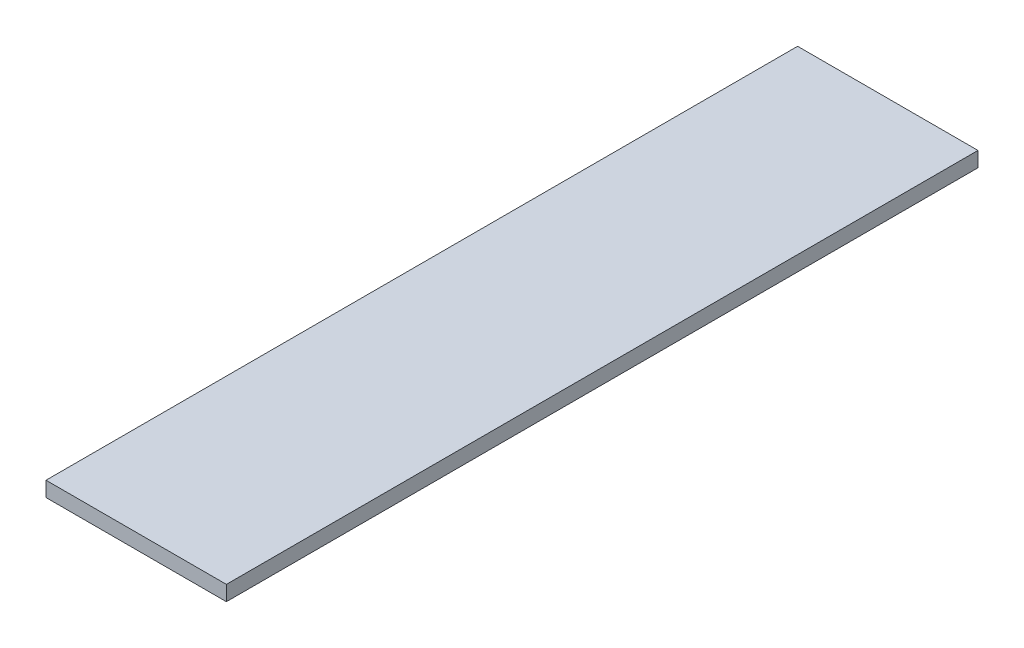
ISO-10303-21;
HEADER;
FILE_DESCRIPTION(('STEP AP214'),'2;1');
FILE_NAME('part.step','',(''),(''),'','','');
FILE_SCHEMA(('AUTOMOTIVE_DESIGN { 1 0 10303 214 1 1 1 1 }'));
ENDSEC;
DATA;
#1=APPLICATION_CONTEXT('core data for automotive mechanical design processes');
#2=APPLICATION_PROTOCOL_DEFINITION('international standard','automotive_design',2000,#1);
#3=PRODUCT_CONTEXT('',#1,'mechanical');
#4=PRODUCT('Part','Part','',(#3));
#5=PRODUCT_RELATED_PRODUCT_CATEGORY('part','',(#4));
#6=PRODUCT_DEFINITION_FORMATION('','',#4);
#7=PRODUCT_DEFINITION_CONTEXT('part definition',#1,'design');
#8=PRODUCT_DEFINITION('design','',#6,#7);
#9=PRODUCT_DEFINITION_SHAPE('','',#8);
#10=(LENGTH_UNIT() NAMED_UNIT(*) SI_UNIT(.MILLI.,.METRE.));
#11=(NAMED_UNIT(*) PLANE_ANGLE_UNIT() SI_UNIT($,.RADIAN.));
#12=(NAMED_UNIT(*) SI_UNIT($,.STERADIAN.) SOLID_ANGLE_UNIT());
#13=UNCERTAINTY_MEASURE_WITH_UNIT(LENGTH_MEASURE(1.E-05),#10,'distance_accuracy_value','');
#14=(GEOMETRIC_REPRESENTATION_CONTEXT(3) GLOBAL_UNCERTAINTY_ASSIGNED_CONTEXT((#13)) GLOBAL_UNIT_ASSIGNED_CONTEXT((#10,
#11,#12)) REPRESENTATION_CONTEXT('',''));
#15=CARTESIAN_POINT('',(0.,0.,0.));
#16=DIRECTION('',(0.,0.,1.));
#17=DIRECTION('',(1.,0.,0.));
#18=AXIS2_PLACEMENT_3D('',#15,#16,#17);
#19=CARTESIAN_POINT('',(0.,0.,500.));
#20=DIRECTION('',(1.,0.,0.));
#21=DIRECTION('',(0.,1.,0.));
#22=AXIS2_PLACEMENT_3D('',#19,#20,#21);
#23=PLANE('',#22);
#24=DIRECTION('',(0.,-1.,0.));
#25=VECTOR('',#24,1.);
#26=CARTESIAN_POINT('',(0.,0.,0.));
#27=LINE('',#26,#25);
#28=CARTESIAN_POINT('',(0.,0.,0.));
#29=VERTEX_POINT('',#28);
#30=CARTESIAN_POINT('',(0.,-10.,0.));
#31=VERTEX_POINT('',#30);
#32=EDGE_CURVE('E102',#29,#31,#27,.T.);
#33=ORIENTED_EDGE('',*,*,#32,.T.);
#34=DIRECTION('',(0.,0.,-1.));
#35=VECTOR('',#34,1.);
#36=CARTESIAN_POINT('',(0.,-10.,500.));
#37=LINE('',#36,#35);
#38=CARTESIAN_POINT('',(0.,-10.,500.));
#39=VERTEX_POINT('',#38);
#40=EDGE_CURVE('E11',#39,#31,#37,.T.);
#41=ORIENTED_EDGE('',*,*,#40,.F.);
#42=DIRECTION('',(0.,-1.,0.));
#43=VECTOR('',#42,1.);
#44=CARTESIAN_POINT('',(0.,0.,500.));
#45=LINE('',#44,#43);
#46=CARTESIAN_POINT('',(0.,0.,500.));
#47=VERTEX_POINT('',#46);
#48=EDGE_CURVE('E90',#47,#39,#45,.T.);
#49=ORIENTED_EDGE('',*,*,#48,.F.);
#50=DIRECTION('',(0.,0.,-1.));
#51=VECTOR('',#50,1.);
#52=CARTESIAN_POINT('',(0.,0.,500.));
#53=LINE('',#52,#51);
#54=EDGE_CURVE('E98',#47,#29,#53,.T.);
#55=ORIENTED_EDGE('',*,*,#54,.T.);
#56=EDGE_LOOP('',(#33,#41,#49,#55));
#57=FACE_BOUND('',#56,.T.);
#58=ADVANCED_FACE('F39',(#57),#23,.F.);
#59=CARTESIAN_POINT('',(0.,-10.,500.));
#60=DIRECTION('',(0.,1.,0.));
#61=DIRECTION('',(0.,0.,1.));
#62=AXIS2_PLACEMENT_3D('',#59,#60,#61);
#63=PLANE('',#62);
#64=DIRECTION('',(1.,0.,0.));
#65=VECTOR('',#64,1.);
#66=CARTESIAN_POINT('',(0.,-10.,0.));
#67=LINE('',#66,#65);
#68=CARTESIAN_POINT('',(120.,-10.,0.));
#69=VERTEX_POINT('',#68);
#70=EDGE_CURVE('E94',#31,#69,#67,.T.);
#71=ORIENTED_EDGE('',*,*,#70,.T.);
#72=DIRECTION('',(0.,0.,-1.));
#73=VECTOR('',#72,1.);
#74=CARTESIAN_POINT('',(120.,-10.,500.));
#75=LINE('',#74,#73);
#76=CARTESIAN_POINT('',(120.,-10.,500.));
#77=VERTEX_POINT('',#76);
#78=EDGE_CURVE('E47',#77,#69,#75,.T.);
#79=ORIENTED_EDGE('',*,*,#78,.F.);
#80=DIRECTION('',(1.,0.,0.));
#81=VECTOR('',#80,1.);
#82=CARTESIAN_POINT('',(0.,-10.,500.));
#83=LINE('',#82,#81);
#84=EDGE_CURVE('E85',#39,#77,#83,.T.);
#85=ORIENTED_EDGE('',*,*,#84,.F.);
#86=ORIENTED_EDGE('',*,*,#40,.T.);
#87=EDGE_LOOP('',(#71,#79,#85,#86));
#88=FACE_BOUND('',#87,.T.);
#89=ADVANCED_FACE('F93',(#88),#63,.F.);
#90=CARTESIAN_POINT('',(120.,0.,500.));
#91=DIRECTION('',(-1.,0.,0.));
#92=DIRECTION('',(0.,0.,1.));
#93=AXIS2_PLACEMENT_3D('',#90,#91,#92);
#94=PLANE('',#93);
#95=DIRECTION('',(0.,1.,0.));
#96=VECTOR('',#95,1.);
#97=CARTESIAN_POINT('',(120.,0.,0.));
#98=LINE('',#97,#96);
#99=CARTESIAN_POINT('',(120.,0.,0.));
#100=VERTEX_POINT('',#99);
#101=EDGE_CURVE('E72',#69,#100,#98,.T.);
#102=ORIENTED_EDGE('',*,*,#101,.T.);
#103=DIRECTION('',(0.,0.,-1.));
#104=VECTOR('',#103,1.);
#105=CARTESIAN_POINT('',(120.,0.,500.));
#106=LINE('',#105,#104);
#107=CARTESIAN_POINT('',(120.,0.,500.));
#108=VERTEX_POINT('',#107);
#109=EDGE_CURVE('E95',#108,#100,#106,.T.);
#110=ORIENTED_EDGE('',*,*,#109,.F.);
#111=DIRECTION('',(0.,1.,0.));
#112=VECTOR('',#111,1.);
#113=CARTESIAN_POINT('',(120.,0.,500.));
#114=LINE('',#113,#112);
#115=EDGE_CURVE('E88',#77,#108,#114,.T.);
#116=ORIENTED_EDGE('',*,*,#115,.F.);
#117=ORIENTED_EDGE('',*,*,#78,.T.);
#118=EDGE_LOOP('',(#102,#110,#116,#117));
#119=FACE_BOUND('',#118,.T.);
#120=ADVANCED_FACE('F96',(#119),#94,.F.);
#121=CARTESIAN_POINT('',(0.,0.,500.));
#122=DIRECTION('',(0.,-1.,0.));
#123=DIRECTION('',(0.,0.,-1.));
#124=AXIS2_PLACEMENT_3D('',#121,#122,#123);
#125=PLANE('',#124);
#126=DIRECTION('',(-1.,0.,0.));
#127=VECTOR('',#126,1.);
#128=CARTESIAN_POINT('',(0.,0.,0.));
#129=LINE('',#128,#127);
#130=EDGE_CURVE('E78',#100,#29,#129,.T.);
#131=ORIENTED_EDGE('',*,*,#130,.T.);
#132=ORIENTED_EDGE('',*,*,#54,.F.);
#133=DIRECTION('',(-1.,0.,0.));
#134=VECTOR('',#133,1.);
#135=CARTESIAN_POINT('',(0.,0.,500.));
#136=LINE('',#135,#134);
#137=EDGE_CURVE('E55',#108,#47,#136,.T.);
#138=ORIENTED_EDGE('',*,*,#137,.F.);
#139=ORIENTED_EDGE('',*,*,#109,.T.);
#140=EDGE_LOOP('',(#131,#132,#138,#139));
#141=FACE_BOUND('',#140,.T.);
#142=ADVANCED_FACE('F109',(#141),#125,.F.);
#143=CARTESIAN_POINT('',(0.,0.,500.));
#144=DIRECTION('',(0.,0.,1.));
#145=DIRECTION('',(1.,0.,0.));
#146=AXIS2_PLACEMENT_3D('',#143,#144,#145);
#147=PLANE('',#146);
#148=ORIENTED_EDGE('',*,*,#48,.T.);
#149=ORIENTED_EDGE('',*,*,#84,.T.);
#150=ORIENTED_EDGE('',*,*,#115,.T.);
#151=ORIENTED_EDGE('',*,*,#137,.T.);
#152=EDGE_LOOP('',(#148,#149,#150,#151));
#153=FACE_BOUND('',#152,.T.);
#154=ADVANCED_FACE('F86',(#153),#147,.T.);
#155=CARTESIAN_POINT('',(0.,0.,0.));
#156=DIRECTION('',(0.,0.,1.));
#157=DIRECTION('',(1.,0.,0.));
#158=AXIS2_PLACEMENT_3D('',#155,#156,#157);
#159=PLANE('',#158);
#160=ORIENTED_EDGE('',*,*,#32,.F.);
#161=ORIENTED_EDGE('',*,*,#130,.F.);
#162=ORIENTED_EDGE('',*,*,#101,.F.);
#163=ORIENTED_EDGE('',*,*,#70,.F.);
#164=EDGE_LOOP('',(#160,#161,#162,#163));
#165=FACE_BOUND('',#164,.T.);
#166=ADVANCED_FACE('F112',(#165),#159,.F.);
#167=CLOSED_SHELL('',(#58,#89,#120,#142,#154,#166));
#168=MANIFOLD_SOLID_BREP('B2',#167);
#169=ADVANCED_BREP_SHAPE_REPRESENTATION('',(#18,#168),#14);
#170=SHAPE_DEFINITION_REPRESENTATION(#9,#169);
ENDSEC;
END-ISO-10303-21;
